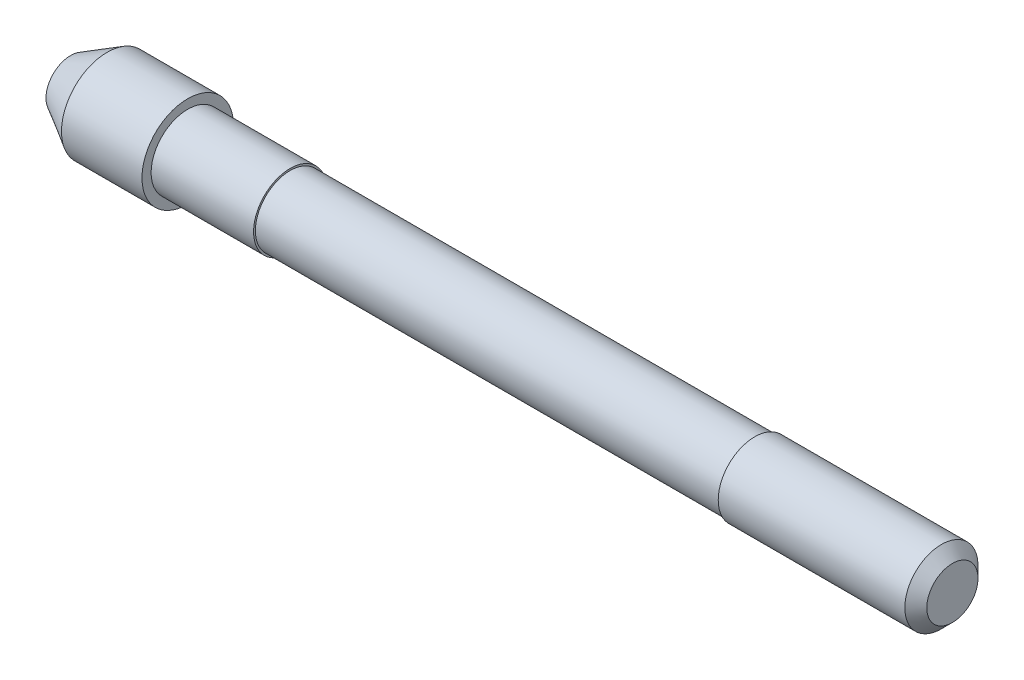
ISO-10303-21;
HEADER;
FILE_DESCRIPTION(('STEP AP214'),'2;1');
FILE_NAME('part.step','',(''),(''),'','','');
FILE_SCHEMA(('AUTOMOTIVE_DESIGN { 1 0 10303 214 1 1 1 1 }'));
ENDSEC;
DATA;
#1=APPLICATION_CONTEXT('core data for automotive mechanical design processes');
#2=APPLICATION_PROTOCOL_DEFINITION('international standard','automotive_design',2000,#1);
#3=PRODUCT_CONTEXT('',#1,'mechanical');
#4=PRODUCT('Part','Part','',(#3));
#5=PRODUCT_RELATED_PRODUCT_CATEGORY('part','',(#4));
#6=PRODUCT_DEFINITION_FORMATION('','',#4);
#7=PRODUCT_DEFINITION_CONTEXT('part definition',#1,'design');
#8=PRODUCT_DEFINITION('design','',#6,#7);
#9=PRODUCT_DEFINITION_SHAPE('','',#8);
#10=(LENGTH_UNIT() NAMED_UNIT(*) SI_UNIT(.MILLI.,.METRE.));
#11=(NAMED_UNIT(*) PLANE_ANGLE_UNIT() SI_UNIT($,.RADIAN.));
#12=(NAMED_UNIT(*) SI_UNIT($,.STERADIAN.) SOLID_ANGLE_UNIT());
#13=UNCERTAINTY_MEASURE_WITH_UNIT(LENGTH_MEASURE(1.E-05),#10,'distance_accuracy_value','');
#14=(GEOMETRIC_REPRESENTATION_CONTEXT(3) GLOBAL_UNCERTAINTY_ASSIGNED_CONTEXT((#13)) GLOBAL_UNIT_ASSIGNED_CONTEXT((#10,
#11,#12)) REPRESENTATION_CONTEXT('',''));
#15=CARTESIAN_POINT('',(0.,0.,0.));
#16=DIRECTION('',(0.,0.,1.));
#17=DIRECTION('',(1.,0.,0.));
#18=AXIS2_PLACEMENT_3D('',#15,#16,#17);
#19=CARTESIAN_POINT('',(12.05,0.,0.));
#20=DIRECTION('',(-1.,0.,0.));
#21=DIRECTION('',(0.,0.,1.));
#22=AXIS2_PLACEMENT_3D('',#19,#20,#21);
#23=PLANE('',#22);
#24=CARTESIAN_POINT('',(12.05,0.,0.));
#25=DIRECTION('',(-1.,0.,0.));
#26=DIRECTION('',(0.,0.,1.));
#27=AXIS2_PLACEMENT_3D('',#24,#25,#26);
#28=CIRCLE('',#27,0.699999999999996);
#29=CARTESIAN_POINT('',(12.05,0.,0.699999999999996));
#30=VERTEX_POINT('',#29);
#31=EDGE_CURVE('E10',#30,#30,#28,.F.);
#32=ORIENTED_EDGE('',*,*,#31,.T.);
#33=EDGE_LOOP('',(#32));
#34=FACE_BOUND('',#33,.T.);
#35=ADVANCED_FACE('F34',(#34),#23,.F.);
#36=CARTESIAN_POINT('',(-12.05,0.,0.));
#37=DIRECTION('',(-1.,0.,0.));
#38=DIRECTION('',(0.,0.,1.));
#39=AXIS2_PLACEMENT_3D('',#36,#37,#38);
#40=CYLINDRICAL_SURFACE('',#39,1.);
#41=CARTESIAN_POINT('',(11.75,0.,0.));
#42=DIRECTION('',(-1.,0.,0.));
#43=DIRECTION('',(0.,0.,1.));
#44=AXIS2_PLACEMENT_3D('',#41,#42,#43);
#45=CIRCLE('',#44,1.);
#46=CARTESIAN_POINT('',(11.75,0.,1.));
#47=VERTEX_POINT('',#46);
#48=EDGE_CURVE('E41',#47,#47,#45,.T.);
#49=ORIENTED_EDGE('',*,*,#48,.T.);
#50=EDGE_LOOP('',(#49));
#51=FACE_BOUND('',#50,.T.);
#52=CARTESIAN_POINT('',(6.65,0.,0.));
#53=DIRECTION('',(-1.,0.,0.));
#54=DIRECTION('',(0.,0.,1.));
#55=AXIS2_PLACEMENT_3D('',#52,#53,#54);
#56=CIRCLE('',#55,0.999999999999999);
#57=CARTESIAN_POINT('',(6.65,0.,0.999999999999999));
#58=VERTEX_POINT('',#57);
#59=EDGE_CURVE('E45',#58,#58,#56,.T.);
#60=ORIENTED_EDGE('',*,*,#59,.F.);
#61=EDGE_LOOP('',(#60));
#62=FACE_BOUND('',#61,.T.);
#63=ADVANCED_FACE('F114',(#51,#62),#40,.T.);
#64=CARTESIAN_POINT('',(6.65,0.999999999999999,0.));
#65=DIRECTION('',(1.,0.,0.));
#66=DIRECTION('',(0.,0.,-1.));
#67=AXIS2_PLACEMENT_3D('',#64,#65,#66);
#68=PLANE('',#67);
#69=CARTESIAN_POINT('',(6.65,0.,0.));
#70=DIRECTION('',(-1.,0.,0.));
#71=DIRECTION('',(0.,0.,1.));
#72=AXIS2_PLACEMENT_3D('',#69,#70,#71);
#73=CIRCLE('',#72,0.95);
#74=CARTESIAN_POINT('',(6.65,0.,0.95));
#75=VERTEX_POINT('',#74);
#76=EDGE_CURVE('E49',#75,#75,#73,.T.);
#77=ORIENTED_EDGE('',*,*,#76,.F.);
#78=EDGE_LOOP('',(#77));
#79=FACE_BOUND('',#78,.T.);
#80=ORIENTED_EDGE('',*,*,#59,.T.);
#81=EDGE_LOOP('',(#80));
#82=FACE_BOUND('',#81,.T.);
#83=ADVANCED_FACE('F108',(#79,#82),#68,.F.);
#84=CARTESIAN_POINT('',(-12.05,0.,0.));
#85=DIRECTION('',(-1.,0.,0.));
#86=DIRECTION('',(0.,0.,1.));
#87=AXIS2_PLACEMENT_3D('',#84,#85,#86);
#88=CYLINDRICAL_SURFACE('',#87,0.949999999999999);
#89=CARTESIAN_POINT('',(-6.05,0.,0.));
#90=DIRECTION('',(-1.,0.,0.));
#91=DIRECTION('',(0.,0.,1.));
#92=AXIS2_PLACEMENT_3D('',#89,#90,#91);
#93=CIRCLE('',#92,0.949999999999999);
#94=CARTESIAN_POINT('',(-6.05,0.,0.949999999999999));
#95=VERTEX_POINT('',#94);
#96=EDGE_CURVE('E54',#95,#95,#93,.T.);
#97=ORIENTED_EDGE('',*,*,#96,.F.);
#98=EDGE_LOOP('',(#97));
#99=FACE_BOUND('',#98,.T.);
#100=ORIENTED_EDGE('',*,*,#76,.T.);
#101=EDGE_LOOP('',(#100));
#102=FACE_BOUND('',#101,.T.);
#103=ADVANCED_FACE('F102',(#99,#102),#88,.T.);
#104=CARTESIAN_POINT('',(-6.05,0.949999999999999,0.));
#105=DIRECTION('',(-1.,0.,0.));
#106=DIRECTION('',(0.,0.,1.));
#107=AXIS2_PLACEMENT_3D('',#104,#105,#106);
#108=PLANE('',#107);
#109=CARTESIAN_POINT('',(-6.05,0.,0.));
#110=DIRECTION('',(-1.,0.,0.));
#111=DIRECTION('',(0.,0.,1.));
#112=AXIS2_PLACEMENT_3D('',#109,#110,#111);
#113=CIRCLE('',#112,0.999999999999999);
#114=CARTESIAN_POINT('',(-6.05,0.,0.999999999999999));
#115=VERTEX_POINT('',#114);
#116=EDGE_CURVE('E57',#115,#115,#113,.T.);
#117=ORIENTED_EDGE('',*,*,#116,.F.);
#118=EDGE_LOOP('',(#117));
#119=FACE_BOUND('',#118,.T.);
#120=ORIENTED_EDGE('',*,*,#96,.T.);
#121=EDGE_LOOP('',(#120));
#122=FACE_BOUND('',#121,.T.);
#123=ADVANCED_FACE('F96',(#119,#122),#108,.F.);
#124=CARTESIAN_POINT('',(-12.05,0.,0.));
#125=DIRECTION('',(-1.,0.,0.));
#126=DIRECTION('',(0.,0.,1.));
#127=AXIS2_PLACEMENT_3D('',#124,#125,#126);
#128=CYLINDRICAL_SURFACE('',#127,0.999999999999999);
#129=CARTESIAN_POINT('',(-8.85,0.,0.));
#130=DIRECTION('',(-1.,0.,0.));
#131=DIRECTION('',(0.,0.,1.));
#132=AXIS2_PLACEMENT_3D('',#129,#130,#131);
#133=CIRCLE('',#132,1.);
#134=CARTESIAN_POINT('',(-8.85,0.,1.));
#135=VERTEX_POINT('',#134);
#136=EDGE_CURVE('E60',#135,#135,#133,.T.);
#137=ORIENTED_EDGE('',*,*,#136,.F.);
#138=EDGE_LOOP('',(#137));
#139=FACE_BOUND('',#138,.T.);
#140=ORIENTED_EDGE('',*,*,#116,.T.);
#141=EDGE_LOOP('',(#140));
#142=FACE_BOUND('',#141,.T.);
#143=ADVANCED_FACE('F90',(#139,#142),#128,.T.);
#144=CARTESIAN_POINT('',(-8.85,1.,0.));
#145=DIRECTION('',(-1.,0.,0.));
#146=DIRECTION('',(0.,0.,1.));
#147=AXIS2_PLACEMENT_3D('',#144,#145,#146);
#148=PLANE('',#147);
#149=CARTESIAN_POINT('',(-8.85,0.,0.));
#150=DIRECTION('',(-1.,0.,0.));
#151=DIRECTION('',(0.,0.,1.));
#152=AXIS2_PLACEMENT_3D('',#149,#150,#151);
#153=CIRCLE('',#152,1.25);
#154=CARTESIAN_POINT('',(-8.85,0.,1.25));
#155=VERTEX_POINT('',#154);
#156=EDGE_CURVE('E63',#155,#155,#153,.T.);
#157=ORIENTED_EDGE('',*,*,#156,.F.);
#158=EDGE_LOOP('',(#157));
#159=FACE_BOUND('',#158,.T.);
#160=ORIENTED_EDGE('',*,*,#136,.T.);
#161=EDGE_LOOP('',(#160));
#162=FACE_BOUND('',#161,.T.);
#163=ADVANCED_FACE('F84',(#159,#162),#148,.F.);
#164=CARTESIAN_POINT('',(-12.05,0.,0.));
#165=DIRECTION('',(-1.,0.,0.));
#166=DIRECTION('',(0.,0.,1.));
#167=AXIS2_PLACEMENT_3D('',#164,#165,#166);
#168=CYLINDRICAL_SURFACE('',#167,1.25);
#169=CARTESIAN_POINT('',(-11.05,0.,0.));
#170=DIRECTION('',(-1.,0.,0.));
#171=DIRECTION('',(0.,0.,1.));
#172=AXIS2_PLACEMENT_3D('',#169,#170,#171);
#173=CIRCLE('',#172,1.25);
#174=CARTESIAN_POINT('',(-11.05,0.,1.25));
#175=VERTEX_POINT('',#174);
#176=EDGE_CURVE('E66',#175,#175,#173,.T.);
#177=ORIENTED_EDGE('',*,*,#176,.F.);
#178=EDGE_LOOP('',(#177));
#179=FACE_BOUND('',#178,.T.);
#180=ORIENTED_EDGE('',*,*,#156,.T.);
#181=EDGE_LOOP('',(#180));
#182=FACE_BOUND('',#181,.T.);
#183=ADVANCED_FACE('F78',(#179,#182),#168,.T.);
#184=CARTESIAN_POINT('',(-11.05,0.,0.));
#185=DIRECTION('',(1.,0.,0.));
#186=DIRECTION('',(0.,0.,-1.));
#187=AXIS2_PLACEMENT_3D('',#184,#185,#186);
#188=CONICAL_SURFACE('',#187,1.25,0.523598775598293);
#189=CARTESIAN_POINT('',(-12.05,0.,0.));
#190=DIRECTION('',(-1.,0.,0.));
#191=DIRECTION('',(0.,0.,1.));
#192=AXIS2_PLACEMENT_3D('',#189,#190,#191);
#193=CIRCLE('',#192,0.672649730810382);
#194=CARTESIAN_POINT('',(-12.05,0.,0.672649730810382));
#195=VERTEX_POINT('',#194);
#196=EDGE_CURVE('E69',#195,#195,#193,.T.);
#197=ORIENTED_EDGE('',*,*,#196,.F.);
#198=EDGE_LOOP('',(#197));
#199=FACE_BOUND('',#198,.T.);
#200=ORIENTED_EDGE('',*,*,#176,.T.);
#201=EDGE_LOOP('',(#200));
#202=FACE_BOUND('',#201,.T.);
#203=ADVANCED_FACE('F75',(#199,#202),#188,.T.);
#204=CARTESIAN_POINT('',(-12.05,0.672649730810382,0.));
#205=DIRECTION('',(1.,0.,0.));
#206=DIRECTION('',(0.,0.,-1.));
#207=AXIS2_PLACEMENT_3D('',#204,#205,#206);
#208=PLANE('',#207);
#209=ORIENTED_EDGE('',*,*,#196,.T.);
#210=EDGE_LOOP('',(#209));
#211=FACE_BOUND('',#210,.T.);
#212=ADVANCED_FACE('F73',(#211),#208,.F.);
#213=CARTESIAN_POINT('',(11.75,0.,0.));
#214=DIRECTION('',(-1.,0.,0.));
#215=DIRECTION('',(0.,0.,1.));
#216=AXIS2_PLACEMENT_3D('',#213,#214,#215);
#217=CONICAL_SURFACE('',#216,1.,0.785398163397458);
#218=ORIENTED_EDGE('',*,*,#31,.F.);
#219=EDGE_LOOP('',(#218));
#220=FACE_BOUND('',#219,.T.);
#221=ORIENTED_EDGE('',*,*,#48,.F.);
#222=EDGE_LOOP('',(#221));
#223=FACE_BOUND('',#222,.T.);
#224=ADVANCED_FACE('F36',(#220,#223),#217,.T.);
#225=CLOSED_SHELL('',(#35,#63,#83,#103,#123,#143,#163,#183,#203,#212,#224));
#226=MANIFOLD_SOLID_BREP('B2',#225);
#227=ADVANCED_BREP_SHAPE_REPRESENTATION('',(#18,#226),#14);
#228=SHAPE_DEFINITION_REPRESENTATION(#9,#227);
ENDSEC;
END-ISO-10303-21;
